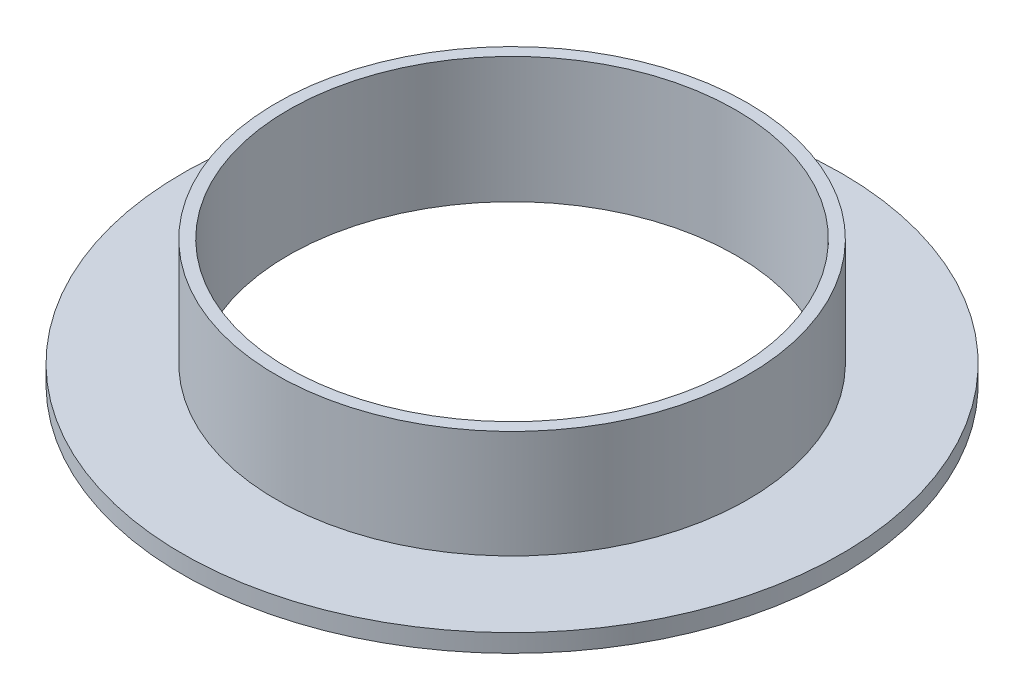
ISO-10303-21;
HEADER;
FILE_DESCRIPTION(('STEP AP214'),'2;1');
FILE_NAME('part.step','',(''),(''),'','','');
FILE_SCHEMA(('AUTOMOTIVE_DESIGN { 1 0 10303 214 1 1 1 1 }'));
ENDSEC;
DATA;
#1=APPLICATION_CONTEXT('core data for automotive mechanical design processes');
#2=APPLICATION_PROTOCOL_DEFINITION('international standard','automotive_design',2000,#1);
#3=PRODUCT_CONTEXT('',#1,'mechanical');
#4=PRODUCT('Part','Part','',(#3));
#5=PRODUCT_RELATED_PRODUCT_CATEGORY('part','',(#4));
#6=PRODUCT_DEFINITION_FORMATION('','',#4);
#7=PRODUCT_DEFINITION_CONTEXT('part definition',#1,'design');
#8=PRODUCT_DEFINITION('design','',#6,#7);
#9=PRODUCT_DEFINITION_SHAPE('','',#8);
#10=(LENGTH_UNIT() NAMED_UNIT(*) SI_UNIT(.MILLI.,.METRE.));
#11=(NAMED_UNIT(*) PLANE_ANGLE_UNIT() SI_UNIT($,.RADIAN.));
#12=(NAMED_UNIT(*) SI_UNIT($,.STERADIAN.) SOLID_ANGLE_UNIT());
#13=UNCERTAINTY_MEASURE_WITH_UNIT(LENGTH_MEASURE(1.E-05),#10,'distance_accuracy_value','');
#14=(GEOMETRIC_REPRESENTATION_CONTEXT(3) GLOBAL_UNCERTAINTY_ASSIGNED_CONTEXT((#13)) GLOBAL_UNIT_ASSIGNED_CONTEXT((#10,
#11,#12)) REPRESENTATION_CONTEXT('',''));
#15=CARTESIAN_POINT('',(0.,0.,0.));
#16=DIRECTION('',(0.,0.,1.));
#17=DIRECTION('',(1.,0.,0.));
#18=AXIS2_PLACEMENT_3D('',#15,#16,#17);
#19=CARTESIAN_POINT('',(0.,0.,0.));
#20=DIRECTION('',(0.,-1.,0.));
#21=DIRECTION('',(0.,0.,-1.));
#22=AXIS2_PLACEMENT_3D('',#19,#20,#21);
#23=CYLINDRICAL_SURFACE('',#22,16.5);
#24=CARTESIAN_POINT('',(0.,0.,0.));
#25=DIRECTION('',(0.,-1.,0.));
#26=DIRECTION('',(0.,0.,-1.));
#27=AXIS2_PLACEMENT_3D('',#24,#25,#26);
#28=CIRCLE('',#27,16.5);
#29=CARTESIAN_POINT('',(0.,0.,-16.5));
#30=VERTEX_POINT('',#29);
#31=EDGE_CURVE('E10',#30,#30,#28,.T.);
#32=ORIENTED_EDGE('',*,*,#31,.F.);
#33=EDGE_LOOP('',(#32));
#34=FACE_BOUND('',#33,.T.);
#35=CARTESIAN_POINT('',(0.,0.899999999999999,0.));
#36=DIRECTION('',(0.,-1.,0.));
#37=DIRECTION('',(0.,0.,-1.));
#38=AXIS2_PLACEMENT_3D('',#35,#36,#37);
#39=CIRCLE('',#38,16.5);
#40=CARTESIAN_POINT('',(0.,0.899999999999999,-16.5));
#41=VERTEX_POINT('',#40);
#42=EDGE_CURVE('E52',#41,#41,#39,.T.);
#43=ORIENTED_EDGE('',*,*,#42,.T.);
#44=EDGE_LOOP('',(#43));
#45=FACE_BOUND('',#44,.T.);
#46=ADVANCED_FACE('F30',(#34,#45),#23,.T.);
#47=CARTESIAN_POINT('',(-16.5,0.,0.));
#48=DIRECTION('',(0.,1.,0.));
#49=DIRECTION('',(0.,0.,1.));
#50=AXIS2_PLACEMENT_3D('',#47,#48,#49);
#51=PLANE('',#50);
#52=CARTESIAN_POINT('',(0.,0.,0.));
#53=DIRECTION('',(0.,-1.,0.));
#54=DIRECTION('',(0.,0.,-1.));
#55=AXIS2_PLACEMENT_3D('',#52,#53,#54);
#56=CIRCLE('',#55,11.2);
#57=CARTESIAN_POINT('',(0.,0.,-11.2));
#58=VERTEX_POINT('',#57);
#59=EDGE_CURVE('E36',#58,#58,#56,.T.);
#60=ORIENTED_EDGE('',*,*,#59,.F.);
#61=EDGE_LOOP('',(#60));
#62=FACE_BOUND('',#61,.T.);
#63=ORIENTED_EDGE('',*,*,#31,.T.);
#64=EDGE_LOOP('',(#63));
#65=FACE_BOUND('',#64,.T.);
#66=ADVANCED_FACE('F77',(#62,#65),#51,.F.);
#67=CARTESIAN_POINT('',(0.,0.,0.));
#68=DIRECTION('',(0.,-1.,0.));
#69=DIRECTION('',(0.,0.,-1.));
#70=AXIS2_PLACEMENT_3D('',#67,#68,#69);
#71=CYLINDRICAL_SURFACE('',#70,11.2);
#72=CARTESIAN_POINT('',(0.,6.3,0.));
#73=DIRECTION('',(0.,-1.,0.));
#74=DIRECTION('',(0.,0.,-1.));
#75=AXIS2_PLACEMENT_3D('',#72,#73,#74);
#76=CIRCLE('',#75,11.2);
#77=CARTESIAN_POINT('',(0.,6.3,-11.2));
#78=VERTEX_POINT('',#77);
#79=EDGE_CURVE('E40',#78,#78,#76,.T.);
#80=ORIENTED_EDGE('',*,*,#79,.F.);
#81=EDGE_LOOP('',(#80));
#82=FACE_BOUND('',#81,.T.);
#83=ORIENTED_EDGE('',*,*,#59,.T.);
#84=EDGE_LOOP('',(#83));
#85=FACE_BOUND('',#84,.T.);
#86=ADVANCED_FACE('F72',(#82,#85),#71,.F.);
#87=CARTESIAN_POINT('',(-11.2,6.3,0.));
#88=DIRECTION('',(0.,-1.,0.));
#89=DIRECTION('',(0.,0.,-1.));
#90=AXIS2_PLACEMENT_3D('',#87,#88,#89);
#91=PLANE('',#90);
#92=CARTESIAN_POINT('',(0.,6.3,0.));
#93=DIRECTION('',(0.,-1.,0.));
#94=DIRECTION('',(0.,0.,-1.));
#95=AXIS2_PLACEMENT_3D('',#92,#93,#94);
#96=CIRCLE('',#95,11.8);
#97=CARTESIAN_POINT('',(0.,6.3,-11.8));
#98=VERTEX_POINT('',#97);
#99=EDGE_CURVE('E44',#98,#98,#96,.T.);
#100=ORIENTED_EDGE('',*,*,#99,.F.);
#101=EDGE_LOOP('',(#100));
#102=FACE_BOUND('',#101,.T.);
#103=ORIENTED_EDGE('',*,*,#79,.T.);
#104=EDGE_LOOP('',(#103));
#105=FACE_BOUND('',#104,.T.);
#106=ADVANCED_FACE('F66',(#102,#105),#91,.F.);
#107=CARTESIAN_POINT('',(0.,0.,0.));
#108=DIRECTION('',(0.,-1.,0.));
#109=DIRECTION('',(0.,0.,-1.));
#110=AXIS2_PLACEMENT_3D('',#107,#108,#109);
#111=CYLINDRICAL_SURFACE('',#110,11.8);
#112=CARTESIAN_POINT('',(0.,0.9,0.));
#113=DIRECTION('',(0.,-1.,0.));
#114=DIRECTION('',(0.,0.,-1.));
#115=AXIS2_PLACEMENT_3D('',#112,#113,#114);
#116=CIRCLE('',#115,11.8);
#117=CARTESIAN_POINT('',(0.,0.9,-11.8));
#118=VERTEX_POINT('',#117);
#119=EDGE_CURVE('E49',#118,#118,#116,.T.);
#120=ORIENTED_EDGE('',*,*,#119,.F.);
#121=EDGE_LOOP('',(#120));
#122=FACE_BOUND('',#121,.T.);
#123=ORIENTED_EDGE('',*,*,#99,.T.);
#124=EDGE_LOOP('',(#123));
#125=FACE_BOUND('',#124,.T.);
#126=ADVANCED_FACE('F60',(#122,#125),#111,.T.);
#127=CARTESIAN_POINT('',(-11.8,0.9,0.));
#128=DIRECTION('',(0.,-1.,0.));
#129=DIRECTION('',(0.,0.,-1.));
#130=AXIS2_PLACEMENT_3D('',#127,#128,#129);
#131=PLANE('',#130);
#132=ORIENTED_EDGE('',*,*,#42,.F.);
#133=EDGE_LOOP('',(#132));
#134=FACE_BOUND('',#133,.T.);
#135=ORIENTED_EDGE('',*,*,#119,.T.);
#136=EDGE_LOOP('',(#135));
#137=FACE_BOUND('',#136,.T.);
#138=ADVANCED_FACE('F57',(#134,#137),#131,.F.);
#139=CLOSED_SHELL('',(#46,#66,#86,#106,#126,#138));
#140=MANIFOLD_SOLID_BREP('B2',#139);
#141=ADVANCED_BREP_SHAPE_REPRESENTATION('',(#18,#140),#14);
#142=SHAPE_DEFINITION_REPRESENTATION(#9,#141);
ENDSEC;
END-ISO-10303-21;
